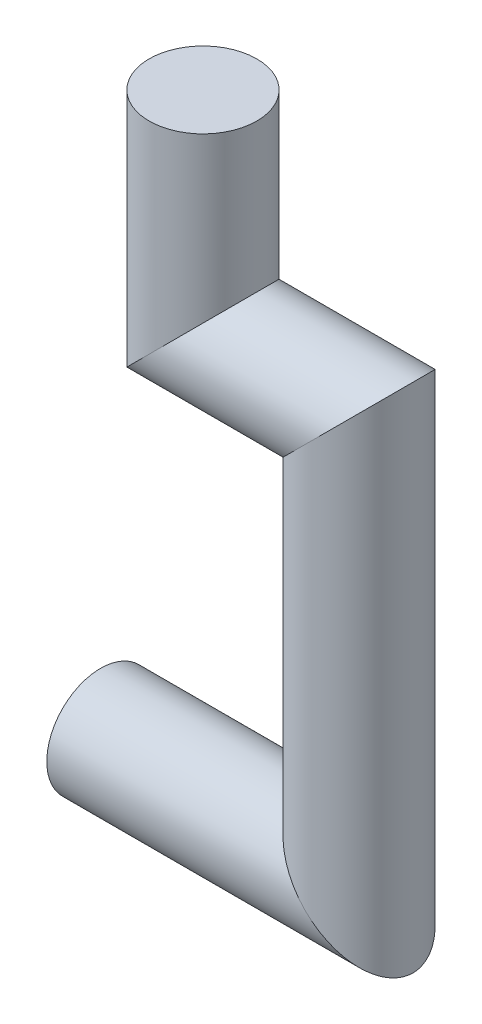
ISO-10303-21;
HEADER;
FILE_DESCRIPTION(('STEP AP214'),'2;1');
FILE_NAME('part.step','',(''),(''),'','','');
FILE_SCHEMA(('AUTOMOTIVE_DESIGN { 1 0 10303 214 1 1 1 1 }'));
ENDSEC;
DATA;
#1=APPLICATION_CONTEXT('core data for automotive mechanical design processes');
#2=APPLICATION_PROTOCOL_DEFINITION('international standard','automotive_design',2000,#1);
#3=PRODUCT_CONTEXT('',#1,'mechanical');
#4=PRODUCT('Part','Part','',(#3));
#5=PRODUCT_RELATED_PRODUCT_CATEGORY('part','',(#4));
#6=PRODUCT_DEFINITION_FORMATION('','',#4);
#7=PRODUCT_DEFINITION_CONTEXT('part definition',#1,'design');
#8=PRODUCT_DEFINITION('design','',#6,#7);
#9=PRODUCT_DEFINITION_SHAPE('','',#8);
#10=(LENGTH_UNIT() NAMED_UNIT(*) SI_UNIT(.MILLI.,.METRE.));
#11=(NAMED_UNIT(*) PLANE_ANGLE_UNIT() SI_UNIT($,.RADIAN.));
#12=(NAMED_UNIT(*) SI_UNIT($,.STERADIAN.) SOLID_ANGLE_UNIT());
#13=UNCERTAINTY_MEASURE_WITH_UNIT(LENGTH_MEASURE(1.E-05),#10,'distance_accuracy_value','');
#14=(GEOMETRIC_REPRESENTATION_CONTEXT(3) GLOBAL_UNCERTAINTY_ASSIGNED_CONTEXT((#13)) GLOBAL_UNIT_ASSIGNED_CONTEXT((#10,
#11,#12)) REPRESENTATION_CONTEXT('',''));
#15=CARTESIAN_POINT('',(0.,0.,0.));
#16=DIRECTION('',(0.,0.,1.));
#17=DIRECTION('',(1.,0.,0.));
#18=AXIS2_PLACEMENT_3D('',#15,#16,#17);
#19=CARTESIAN_POINT('',(0.,-125.,0.));
#20=DIRECTION('',(1.,0.,0.));
#21=DIRECTION('',(0.,0.,-1.));
#22=AXIS2_PLACEMENT_3D('',#19,#20,#21);
#23=PLANE('',#22);
#24=CARTESIAN_POINT('',(0.,-125.,0.));
#25=DIRECTION('',(1.,0.,0.));
#26=DIRECTION('',(0.,0.,-1.));
#27=AXIS2_PLACEMENT_3D('',#24,#25,#26);
#28=CIRCLE('',#27,20.);
#29=CARTESIAN_POINT('',(0.,-125.,-20.));
#30=VERTEX_POINT('',#29);
#31=EDGE_CURVE('E37',#30,#30,#28,.T.);
#32=ORIENTED_EDGE('',*,*,#31,.F.);
#33=EDGE_LOOP('',(#32));
#34=FACE_BOUND('',#33,.T.);
#35=ADVANCED_FACE('F34',(#34),#23,.F.);
#36=CARTESIAN_POINT('',(38.,100.,0.));
#37=DIRECTION('',(0.,1.,0.));
#38=DIRECTION('',(0.,0.,-1.));
#39=AXIS2_PLACEMENT_3D('',#36,#37,#38);
#40=PLANE('',#39);
#41=CARTESIAN_POINT('',(38.,100.,0.));
#42=DIRECTION('',(0.,1.,0.));
#43=DIRECTION('',(0.,0.,-1.));
#44=AXIS2_PLACEMENT_3D('',#41,#42,#43);
#45=CIRCLE('',#44,20.);
#46=CARTESIAN_POINT('',(38.,100.,-20.));
#47=VERTEX_POINT('',#46);
#48=EDGE_CURVE('E41',#47,#47,#45,.T.);
#49=ORIENTED_EDGE('',*,*,#48,.T.);
#50=EDGE_LOOP('',(#49));
#51=FACE_BOUND('',#50,.T.);
#52=ADVANCED_FACE('F60',(#51),#40,.T.);
#53=CARTESIAN_POINT('',(140.1,-125.,0.));
#54=DIRECTION('',(-1.,0.,0.));
#55=DIRECTION('',(0.,-1.,0.));
#56=AXIS2_PLACEMENT_3D('',#53,#54,#55);
#57=CYLINDRICAL_SURFACE('',#56,20.);
#58=CARTESIAN_POINT('',(96.,-125.,0.));
#59=DIRECTION('',(-0.707106781186547,-0.707106781186548,0.));
#60=DIRECTION('',(0.707106781186548,-0.707106781186547,0.));
#61=AXIS2_PLACEMENT_3D('',#58,#59,#60);
#62=ELLIPSE('',#61,28.2842712474619,20.);
#63=CARTESIAN_POINT('',(116.,-145.,0.));
#64=VERTEX_POINT('',#63);
#65=EDGE_CURVE('E50',#64,#64,#62,.T.);
#66=ORIENTED_EDGE('',*,*,#65,.T.);
#67=EDGE_LOOP('',(#66));
#68=FACE_BOUND('',#67,.T.);
#69=ORIENTED_EDGE('',*,*,#31,.T.);
#70=EDGE_LOOP('',(#69));
#71=FACE_BOUND('',#70,.T.);
#72=ADVANCED_FACE('F57',(#68,#71),#57,.T.);
#73=CARTESIAN_POINT('',(96.,69.1,0.));
#74=DIRECTION('',(0.,-1.,0.));
#75=DIRECTION('',(1.,0.,0.));
#76=AXIS2_PLACEMENT_3D('',#73,#74,#75);
#77=CYLINDRICAL_SURFACE('',#76,20.);
#78=CARTESIAN_POINT('',(96.,25.,0.));
#79=DIRECTION('',(0.707106781186547,-0.707106781186547,0.));
#80=DIRECTION('',(0.707106781186548,0.707106781186548,0.));
#81=AXIS2_PLACEMENT_3D('',#78,#79,#80);
#82=ELLIPSE('',#81,28.2842712474619,20.);
#83=CARTESIAN_POINT('',(116.,45.,0.));
#84=VERTEX_POINT('',#83);
#85=EDGE_CURVE('E46',#84,#84,#82,.T.);
#86=ORIENTED_EDGE('',*,*,#85,.T.);
#87=EDGE_LOOP('',(#86));
#88=FACE_BOUND('',#87,.T.);
#89=ORIENTED_EDGE('',*,*,#65,.F.);
#90=EDGE_LOOP('',(#89));
#91=FACE_BOUND('',#90,.T.);
#92=ADVANCED_FACE('F73',(#88,#91),#77,.T.);
#93=CARTESIAN_POINT('',(-6.10000000000001,25.,0.));
#94=DIRECTION('',(1.,0.,0.));
#95=DIRECTION('',(0.,0.,-1.));
#96=AXIS2_PLACEMENT_3D('',#93,#94,#95);
#97=CYLINDRICAL_SURFACE('',#96,20.);
#98=CARTESIAN_POINT('',(38.,25.,0.));
#99=DIRECTION('',(0.707106781186547,-0.707106781186547,0.));
#100=DIRECTION('',(-0.707106781186548,-0.707106781186548,0.));
#101=AXIS2_PLACEMENT_3D('',#98,#99,#100);
#102=ELLIPSE('',#101,28.2842712474619,20.);
#103=CARTESIAN_POINT('',(18.,5.,0.));
#104=VERTEX_POINT('',#103);
#105=EDGE_CURVE('E10',#104,#104,#102,.T.);
#106=ORIENTED_EDGE('',*,*,#105,.T.);
#107=EDGE_LOOP('',(#106));
#108=FACE_BOUND('',#107,.T.);
#109=ORIENTED_EDGE('',*,*,#85,.F.);
#110=EDGE_LOOP('',(#109));
#111=FACE_BOUND('',#110,.T.);
#112=ADVANCED_FACE('F67',(#108,#111),#97,.T.);
#113=CARTESIAN_POINT('',(38.,100.,0.));
#114=DIRECTION('',(0.,-1.,0.));
#115=DIRECTION('',(1.,0.,0.));
#116=AXIS2_PLACEMENT_3D('',#113,#114,#115);
#117=CYLINDRICAL_SURFACE('',#116,20.);
#118=ORIENTED_EDGE('',*,*,#48,.F.);
#119=EDGE_LOOP('',(#118));
#120=FACE_BOUND('',#119,.T.);
#121=ORIENTED_EDGE('',*,*,#105,.F.);
#122=EDGE_LOOP('',(#121));
#123=FACE_BOUND('',#122,.T.);
#124=ADVANCED_FACE('F65',(#120,#123),#117,.T.);
#125=CLOSED_SHELL('',(#35,#52,#72,#92,#112,#124));
#126=MANIFOLD_SOLID_BREP('B2',#125);
#127=ADVANCED_BREP_SHAPE_REPRESENTATION('',(#18,#126),#14);
#128=SHAPE_DEFINITION_REPRESENTATION(#9,#127);
ENDSEC;
END-ISO-10303-21;
